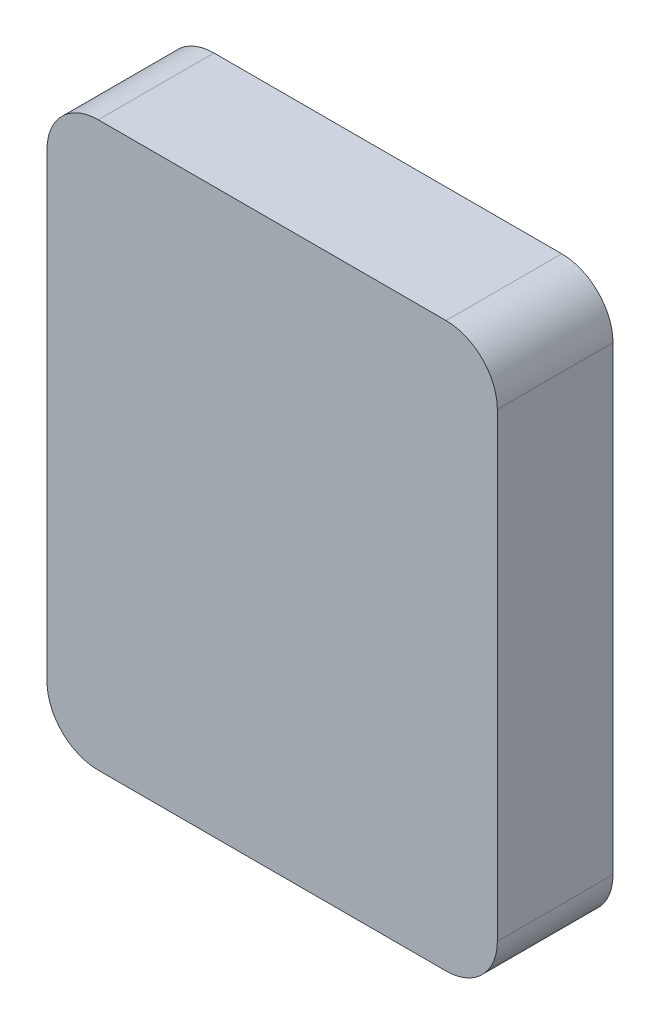
ISO-10303-21;
HEADER;
FILE_DESCRIPTION(('STEP AP214'),'2;1');
FILE_NAME('part.step','',(''),(''),'','','');
FILE_SCHEMA(('AUTOMOTIVE_DESIGN { 1 0 10303 214 1 1 1 1 }'));
ENDSEC;
DATA;
#1=APPLICATION_CONTEXT('core data for automotive mechanical design processes');
#2=APPLICATION_PROTOCOL_DEFINITION('international standard','automotive_design',2000,#1);
#3=PRODUCT_CONTEXT('',#1,'mechanical');
#4=PRODUCT('Part','Part','',(#3));
#5=PRODUCT_RELATED_PRODUCT_CATEGORY('part','',(#4));
#6=PRODUCT_DEFINITION_FORMATION('','',#4);
#7=PRODUCT_DEFINITION_CONTEXT('part definition',#1,'design');
#8=PRODUCT_DEFINITION('design','',#6,#7);
#9=PRODUCT_DEFINITION_SHAPE('','',#8);
#10=(LENGTH_UNIT() NAMED_UNIT(*) SI_UNIT(.MILLI.,.METRE.));
#11=(NAMED_UNIT(*) PLANE_ANGLE_UNIT() SI_UNIT($,.RADIAN.));
#12=(NAMED_UNIT(*) SI_UNIT($,.STERADIAN.) SOLID_ANGLE_UNIT());
#13=UNCERTAINTY_MEASURE_WITH_UNIT(LENGTH_MEASURE(1.E-05),#10,'distance_accuracy_value','');
#14=(GEOMETRIC_REPRESENTATION_CONTEXT(3) GLOBAL_UNCERTAINTY_ASSIGNED_CONTEXT((#13)) GLOBAL_UNIT_ASSIGNED_CONTEXT((#10,
#11,#12)) REPRESENTATION_CONTEXT('',''));
#15=CARTESIAN_POINT('',(0.,0.,0.));
#16=DIRECTION('',(0.,0.,1.));
#17=DIRECTION('',(1.,0.,0.));
#18=AXIS2_PLACEMENT_3D('',#15,#16,#17);
#19=CARTESIAN_POINT('',(-17.4747675580234,46.647032967033,15.7856));
#20=DIRECTION('',(0.,0.,-1.));
#21=DIRECTION('',(-1.,0.,0.));
#22=AXIS2_PLACEMENT_3D('',#19,#20,#21);
#23=CYLINDRICAL_SURFACE('',#22,7.);
#24=CARTESIAN_POINT('',(-17.4747675580234,46.647032967033,0.));
#25=DIRECTION('',(0.,0.,1.));
#26=DIRECTION('',(-1.,0.,0.));
#27=AXIS2_PLACEMENT_3D('',#24,#25,#26);
#28=CIRCLE('',#27,7.);
#29=CARTESIAN_POINT('',(-17.4747675580233,53.647032967033,0.));
#30=VERTEX_POINT('',#29);
#31=CARTESIAN_POINT('',(-24.4747675580234,46.6470329670329,0.));
#32=VERTEX_POINT('',#31);
#33=EDGE_CURVE('E137',#30,#32,#28,.T.);
#34=ORIENTED_EDGE('',*,*,#33,.T.);
#35=DIRECTION('',(0.,0.,-1.));
#36=VECTOR('',#35,1.);
#37=CARTESIAN_POINT('',(-24.4747675580234,46.6470329670329,15.7856));
#38=LINE('',#37,#36);
#39=CARTESIAN_POINT('',(-24.4747675580234,46.6470329670329,15.7856));
#40=VERTEX_POINT('',#39);
#41=EDGE_CURVE('E11',#40,#32,#38,.T.);
#42=ORIENTED_EDGE('',*,*,#41,.F.);
#43=CARTESIAN_POINT('',(-17.4747675580234,46.647032967033,15.7856));
#44=DIRECTION('',(0.,0.,1.));
#45=DIRECTION('',(-1.,0.,0.));
#46=AXIS2_PLACEMENT_3D('',#43,#44,#45);
#47=CIRCLE('',#46,7.);
#48=CARTESIAN_POINT('',(-17.4747675580233,53.647032967033,15.7856));
#49=VERTEX_POINT('',#48);
#50=EDGE_CURVE('E151',#49,#40,#47,.T.);
#51=ORIENTED_EDGE('',*,*,#50,.F.);
#52=DIRECTION('',(0.,0.,-1.));
#53=VECTOR('',#52,1.);
#54=CARTESIAN_POINT('',(-17.4747675580233,53.647032967033,15.7856));
#55=LINE('',#54,#53);
#56=EDGE_CURVE('E133',#49,#30,#55,.T.);
#57=ORIENTED_EDGE('',*,*,#56,.T.);
#58=EDGE_LOOP('',(#34,#42,#51,#57));
#59=FACE_BOUND('',#58,.T.);
#60=ADVANCED_FACE('F41',(#59),#23,.T.);
#61=CARTESIAN_POINT('',(-24.4747675580234,46.6470329670329,15.7856));
#62=DIRECTION('',(1.,0.,0.));
#63=DIRECTION('',(0.,1.,0.));
#64=AXIS2_PLACEMENT_3D('',#61,#62,#63);
#65=PLANE('',#64);
#66=DIRECTION('',(0.,-1.,0.));
#67=VECTOR('',#66,1.);
#68=CARTESIAN_POINT('',(-24.4747675580234,46.6470329670329,0.));
#69=LINE('',#68,#67);
#70=CARTESIAN_POINT('',(-24.4747675580234,-16.232967032967,0.));
#71=VERTEX_POINT('',#70);
#72=EDGE_CURVE('E140',#32,#71,#69,.T.);
#73=ORIENTED_EDGE('',*,*,#72,.T.);
#74=DIRECTION('',(0.,0.,-1.));
#75=VECTOR('',#74,1.);
#76=CARTESIAN_POINT('',(-24.4747675580234,-16.232967032967,15.7856));
#77=LINE('',#76,#75);
#78=CARTESIAN_POINT('',(-24.4747675580234,-16.232967032967,15.7856));
#79=VERTEX_POINT('',#78);
#80=EDGE_CURVE('E49',#79,#71,#77,.T.);
#81=ORIENTED_EDGE('',*,*,#80,.F.);
#82=DIRECTION('',(0.,-1.,0.));
#83=VECTOR('',#82,1.);
#84=CARTESIAN_POINT('',(-24.4747675580234,46.6470329670329,15.7856));
#85=LINE('',#84,#83);
#86=EDGE_CURVE('E100',#40,#79,#85,.T.);
#87=ORIENTED_EDGE('',*,*,#86,.F.);
#88=ORIENTED_EDGE('',*,*,#41,.T.);
#89=EDGE_LOOP('',(#73,#81,#87,#88));
#90=FACE_BOUND('',#89,.T.);
#91=ADVANCED_FACE('F186',(#90),#65,.F.);
#92=CARTESIAN_POINT('',(-17.4747675580234,-16.232967032967,15.7856));
#93=DIRECTION('',(0.,0.,-1.));
#94=DIRECTION('',(-1.,0.,0.));
#95=AXIS2_PLACEMENT_3D('',#92,#93,#94);
#96=CYLINDRICAL_SURFACE('',#95,7.);
#97=CARTESIAN_POINT('',(-17.4747675580234,-16.232967032967,0.));
#98=DIRECTION('',(0.,0.,1.));
#99=DIRECTION('',(1.,0.,0.));
#100=AXIS2_PLACEMENT_3D('',#97,#98,#99);
#101=CIRCLE('',#100,7.);
#102=CARTESIAN_POINT('',(-17.4747675580233,-23.232967032967,0.));
#103=VERTEX_POINT('',#102);
#104=EDGE_CURVE('E142',#71,#103,#101,.T.);
#105=ORIENTED_EDGE('',*,*,#104,.T.);
#106=DIRECTION('',(0.,0.,-1.));
#107=VECTOR('',#106,1.);
#108=CARTESIAN_POINT('',(-17.4747675580233,-23.232967032967,15.7856));
#109=LINE('',#108,#107);
#110=CARTESIAN_POINT('',(-17.4747675580233,-23.232967032967,15.7856));
#111=VERTEX_POINT('',#110);
#112=EDGE_CURVE('E158',#111,#103,#109,.T.);
#113=ORIENTED_EDGE('',*,*,#112,.F.);
#114=CARTESIAN_POINT('',(-17.4747675580234,-16.232967032967,15.7856));
#115=DIRECTION('',(0.,0.,1.));
#116=DIRECTION('',(1.,0.,0.));
#117=AXIS2_PLACEMENT_3D('',#114,#115,#116);
#118=CIRCLE('',#117,7.);
#119=EDGE_CURVE('E166',#79,#111,#118,.T.);
#120=ORIENTED_EDGE('',*,*,#119,.F.);
#121=ORIENTED_EDGE('',*,*,#80,.T.);
#122=EDGE_LOOP('',(#105,#113,#120,#121));
#123=FACE_BOUND('',#122,.T.);
#124=ADVANCED_FACE('F164',(#123),#96,.T.);
#125=CARTESIAN_POINT('',(-17.4747675580233,-23.232967032967,15.7856));
#126=DIRECTION('',(0.,1.,0.));
#127=DIRECTION('',(0.,0.,1.));
#128=AXIS2_PLACEMENT_3D('',#125,#126,#127);
#129=PLANE('',#128);
#130=DIRECTION('',(1.,0.,0.));
#131=VECTOR('',#130,1.);
#132=CARTESIAN_POINT('',(-17.4747675580233,-23.232967032967,0.));
#133=LINE('',#132,#131);
#134=CARTESIAN_POINT('',(29.9852324419766,-23.232967032967,0.));
#135=VERTEX_POINT('',#134);
#136=EDGE_CURVE('E144',#103,#135,#133,.T.);
#137=ORIENTED_EDGE('',*,*,#136,.T.);
#138=DIRECTION('',(0.,0.,-1.));
#139=VECTOR('',#138,1.);
#140=CARTESIAN_POINT('',(29.9852324419766,-23.232967032967,15.7856));
#141=LINE('',#140,#139);
#142=CARTESIAN_POINT('',(29.9852324419766,-23.232967032967,15.7856));
#143=VERTEX_POINT('',#142);
#144=EDGE_CURVE('E155',#143,#135,#141,.T.);
#145=ORIENTED_EDGE('',*,*,#144,.F.);
#146=DIRECTION('',(1.,0.,0.));
#147=VECTOR('',#146,1.);
#148=CARTESIAN_POINT('',(-17.4747675580233,-23.232967032967,15.7856));
#149=LINE('',#148,#147);
#150=EDGE_CURVE('E178',#111,#143,#149,.T.);
#151=ORIENTED_EDGE('',*,*,#150,.F.);
#152=ORIENTED_EDGE('',*,*,#112,.T.);
#153=EDGE_LOOP('',(#137,#145,#151,#152));
#154=FACE_BOUND('',#153,.T.);
#155=ADVANCED_FACE('F174',(#154),#129,.F.);
#156=CARTESIAN_POINT('',(29.9852324419766,-16.232967032967,15.7856));
#157=DIRECTION('',(0.,0.,-1.));
#158=DIRECTION('',(-1.,0.,0.));
#159=AXIS2_PLACEMENT_3D('',#156,#157,#158);
#160=CYLINDRICAL_SURFACE('',#159,7.);
#161=CARTESIAN_POINT('',(29.9852324419766,-16.232967032967,0.));
#162=DIRECTION('',(0.,0.,1.));
#163=DIRECTION('',(1.,0.,0.));
#164=AXIS2_PLACEMENT_3D('',#161,#162,#163);
#165=CIRCLE('',#164,7.);
#166=CARTESIAN_POINT('',(36.9852324419766,-16.232967032967,0.));
#167=VERTEX_POINT('',#166);
#168=EDGE_CURVE('E146',#135,#167,#165,.T.);
#169=ORIENTED_EDGE('',*,*,#168,.T.);
#170=DIRECTION('',(0.,0.,-1.));
#171=VECTOR('',#170,1.);
#172=CARTESIAN_POINT('',(36.9852324419766,-16.232967032967,15.7856));
#173=LINE('',#172,#171);
#174=CARTESIAN_POINT('',(36.9852324419766,-16.232967032967,15.7856));
#175=VERTEX_POINT('',#174);
#176=EDGE_CURVE('E128',#175,#167,#173,.T.);
#177=ORIENTED_EDGE('',*,*,#176,.F.);
#178=CARTESIAN_POINT('',(29.9852324419766,-16.232967032967,15.7856));
#179=DIRECTION('',(0.,0.,1.));
#180=DIRECTION('',(1.,0.,0.));
#181=AXIS2_PLACEMENT_3D('',#178,#179,#180);
#182=CIRCLE('',#181,7.);
#183=EDGE_CURVE('E119',#143,#175,#182,.T.);
#184=ORIENTED_EDGE('',*,*,#183,.F.);
#185=ORIENTED_EDGE('',*,*,#144,.T.);
#186=EDGE_LOOP('',(#169,#177,#184,#185));
#187=FACE_BOUND('',#186,.T.);
#188=ADVANCED_FACE('F177',(#187),#160,.T.);
#189=CARTESIAN_POINT('',(36.9852324419766,-16.232967032967,15.7856));
#190=DIRECTION('',(-1.,0.,0.));
#191=DIRECTION('',(0.,0.,1.));
#192=AXIS2_PLACEMENT_3D('',#189,#190,#191);
#193=PLANE('',#192);
#194=DIRECTION('',(0.,1.,0.));
#195=VECTOR('',#194,1.);
#196=CARTESIAN_POINT('',(36.9852324419766,-16.232967032967,0.));
#197=LINE('',#196,#195);
#198=CARTESIAN_POINT('',(36.9852324419766,46.647032967033,0.));
#199=VERTEX_POINT('',#198);
#200=EDGE_CURVE('E127',#167,#199,#197,.T.);
#201=ORIENTED_EDGE('',*,*,#200,.T.);
#202=DIRECTION('',(0.,0.,-1.));
#203=VECTOR('',#202,1.);
#204=CARTESIAN_POINT('',(36.9852324419766,46.647032967033,15.7856));
#205=LINE('',#204,#203);
#206=CARTESIAN_POINT('',(36.9852324419766,46.647032967033,15.7856));
#207=VERTEX_POINT('',#206);
#208=EDGE_CURVE('E124',#207,#199,#205,.T.);
#209=ORIENTED_EDGE('',*,*,#208,.F.);
#210=DIRECTION('',(0.,1.,0.));
#211=VECTOR('',#210,1.);
#212=CARTESIAN_POINT('',(36.9852324419766,-16.232967032967,15.7856));
#213=LINE('',#212,#211);
#214=EDGE_CURVE('E113',#175,#207,#213,.T.);
#215=ORIENTED_EDGE('',*,*,#214,.F.);
#216=ORIENTED_EDGE('',*,*,#176,.T.);
#217=EDGE_LOOP('',(#201,#209,#215,#216));
#218=FACE_BOUND('',#217,.T.);
#219=ADVANCED_FACE('F125',(#218),#193,.F.);
#220=CARTESIAN_POINT('',(29.9852324419766,46.647032967033,15.7856));
#221=DIRECTION('',(0.,0.,-1.));
#222=DIRECTION('',(-1.,0.,0.));
#223=AXIS2_PLACEMENT_3D('',#220,#221,#222);
#224=CYLINDRICAL_SURFACE('',#223,7.);
#225=CARTESIAN_POINT('',(29.9852324419766,46.647032967033,0.));
#226=DIRECTION('',(0.,0.,1.));
#227=DIRECTION('',(1.,0.,0.));
#228=AXIS2_PLACEMENT_3D('',#225,#226,#227);
#229=CIRCLE('',#228,7.);
#230=CARTESIAN_POINT('',(29.9852324419766,53.647032967033,0.));
#231=VERTEX_POINT('',#230);
#232=EDGE_CURVE('E86',#199,#231,#229,.T.);
#233=ORIENTED_EDGE('',*,*,#232,.T.);
#234=DIRECTION('',(0.,0.,-1.));
#235=VECTOR('',#234,1.);
#236=CARTESIAN_POINT('',(29.9852324419766,53.647032967033,15.7856));
#237=LINE('',#236,#235);
#238=CARTESIAN_POINT('',(29.9852324419766,53.647032967033,15.7856));
#239=VERTEX_POINT('',#238);
#240=EDGE_CURVE('E129',#239,#231,#237,.T.);
#241=ORIENTED_EDGE('',*,*,#240,.F.);
#242=CARTESIAN_POINT('',(29.9852324419766,46.647032967033,15.7856));
#243=DIRECTION('',(0.,0.,1.));
#244=DIRECTION('',(1.,0.,0.));
#245=AXIS2_PLACEMENT_3D('',#242,#243,#244);
#246=CIRCLE('',#245,7.);
#247=EDGE_CURVE('E117',#207,#239,#246,.T.);
#248=ORIENTED_EDGE('',*,*,#247,.F.);
#249=ORIENTED_EDGE('',*,*,#208,.T.);
#250=EDGE_LOOP('',(#233,#241,#248,#249));
#251=FACE_BOUND('',#250,.T.);
#252=ADVANCED_FACE('F131',(#251),#224,.T.);
#253=CARTESIAN_POINT('',(29.9852324419766,53.647032967033,15.7856));
#254=DIRECTION('',(0.,-1.,0.));
#255=DIRECTION('',(1.,0.,0.));
#256=AXIS2_PLACEMENT_3D('',#253,#254,#255);
#257=PLANE('',#256);
#258=DIRECTION('',(-1.,0.,0.));
#259=VECTOR('',#258,1.);
#260=CARTESIAN_POINT('',(29.9852324419766,53.647032967033,0.));
#261=LINE('',#260,#259);
#262=EDGE_CURVE('E92',#231,#30,#261,.T.);
#263=ORIENTED_EDGE('',*,*,#262,.T.);
#264=ORIENTED_EDGE('',*,*,#56,.F.);
#265=DIRECTION('',(-1.,0.,0.));
#266=VECTOR('',#265,1.);
#267=CARTESIAN_POINT('',(29.9852324419766,53.647032967033,15.7856));
#268=LINE('',#267,#266);
#269=EDGE_CURVE('E57',#239,#49,#268,.T.);
#270=ORIENTED_EDGE('',*,*,#269,.F.);
#271=ORIENTED_EDGE('',*,*,#240,.T.);
#272=EDGE_LOOP('',(#263,#264,#270,#271));
#273=FACE_BOUND('',#272,.T.);
#274=ADVANCED_FACE('F202',(#273),#257,.F.);
#275=CARTESIAN_POINT('',(-17.4747675580234,46.647032967033,15.7856));
#276=DIRECTION('',(0.,0.,-1.));
#277=DIRECTION('',(-1.,0.,0.));
#278=AXIS2_PLACEMENT_3D('',#275,#276,#277);
#279=PLANE('',#278);
#280=ORIENTED_EDGE('',*,*,#50,.T.);
#281=ORIENTED_EDGE('',*,*,#86,.T.);
#282=ORIENTED_EDGE('',*,*,#119,.T.);
#283=ORIENTED_EDGE('',*,*,#150,.T.);
#284=ORIENTED_EDGE('',*,*,#183,.T.);
#285=ORIENTED_EDGE('',*,*,#214,.T.);
#286=ORIENTED_EDGE('',*,*,#247,.T.);
#287=ORIENTED_EDGE('',*,*,#269,.T.);
#288=EDGE_LOOP('',(#280,#281,#282,#283,#284,#285,#286,#287));
#289=FACE_BOUND('',#288,.T.);
#290=ADVANCED_FACE('F115',(#289),#279,.F.);
#291=CARTESIAN_POINT('',(-17.4747675580234,46.647032967033,0.));
#292=DIRECTION('',(0.,0.,-1.));
#293=DIRECTION('',(-1.,0.,0.));
#294=AXIS2_PLACEMENT_3D('',#291,#292,#293);
#295=PLANE('',#294);
#296=ORIENTED_EDGE('',*,*,#33,.F.);
#297=ORIENTED_EDGE('',*,*,#262,.F.);
#298=ORIENTED_EDGE('',*,*,#232,.F.);
#299=ORIENTED_EDGE('',*,*,#200,.F.);
#300=ORIENTED_EDGE('',*,*,#168,.F.);
#301=ORIENTED_EDGE('',*,*,#136,.F.);
#302=ORIENTED_EDGE('',*,*,#104,.F.);
#303=ORIENTED_EDGE('',*,*,#72,.F.);
#304=EDGE_LOOP('',(#296,#297,#298,#299,#300,#301,#302,#303));
#305=FACE_BOUND('',#304,.T.);
#306=ADVANCED_FACE('F170',(#305),#295,.T.);
#307=CLOSED_SHELL('',(#60,#91,#124,#155,#188,#219,#252,#274,#290,#306));
#308=MANIFOLD_SOLID_BREP('B2',#307);
#309=ADVANCED_BREP_SHAPE_REPRESENTATION('',(#18,#308),#14);
#310=SHAPE_DEFINITION_REPRESENTATION(#9,#309);
ENDSEC;
END-ISO-10303-21;
